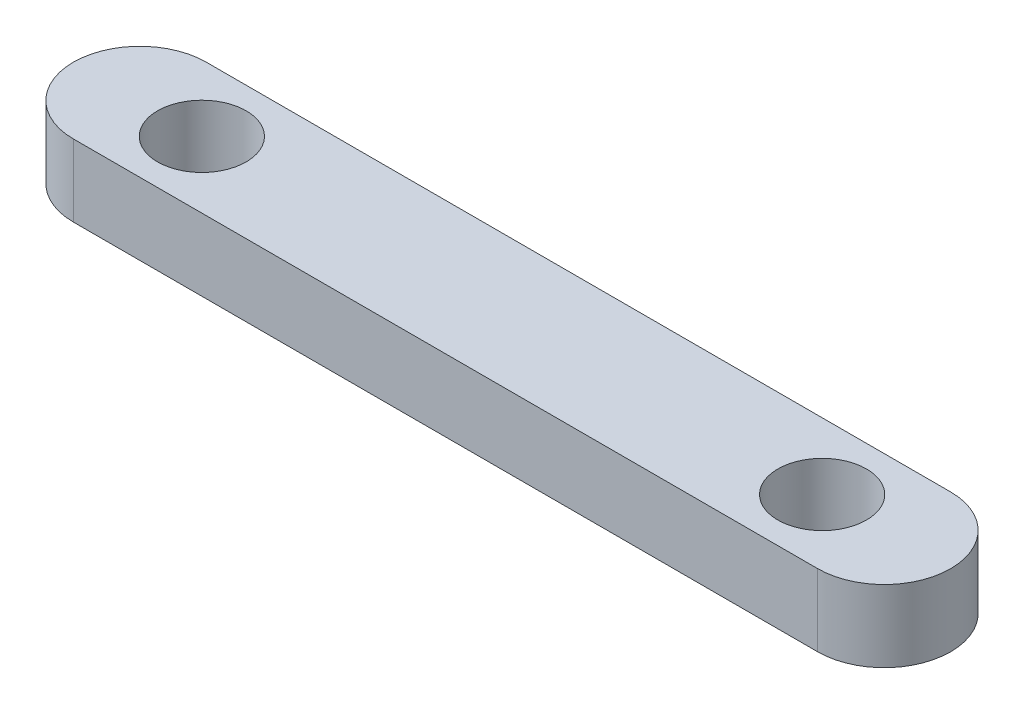
ISO-10303-21;
HEADER;
FILE_DESCRIPTION(('STEP AP214'),'2;1');
FILE_NAME('part.step','',(''),(''),'','','');
FILE_SCHEMA(('AUTOMOTIVE_DESIGN { 1 0 10303 214 1 1 1 1 }'));
ENDSEC;
DATA;
#1=APPLICATION_CONTEXT('core data for automotive mechanical design processes');
#2=APPLICATION_PROTOCOL_DEFINITION('international standard','automotive_design',2000,#1);
#3=PRODUCT_CONTEXT('',#1,'mechanical');
#4=PRODUCT('Part','Part','',(#3));
#5=PRODUCT_RELATED_PRODUCT_CATEGORY('part','',(#4));
#6=PRODUCT_DEFINITION_FORMATION('','',#4);
#7=PRODUCT_DEFINITION_CONTEXT('part definition',#1,'design');
#8=PRODUCT_DEFINITION('design','',#6,#7);
#9=PRODUCT_DEFINITION_SHAPE('','',#8);
#10=(LENGTH_UNIT() NAMED_UNIT(*) SI_UNIT(.MILLI.,.METRE.));
#11=(NAMED_UNIT(*) PLANE_ANGLE_UNIT() SI_UNIT($,.RADIAN.));
#12=(NAMED_UNIT(*) SI_UNIT($,.STERADIAN.) SOLID_ANGLE_UNIT());
#13=UNCERTAINTY_MEASURE_WITH_UNIT(LENGTH_MEASURE(1.E-05),#10,'distance_accuracy_value','');
#14=(GEOMETRIC_REPRESENTATION_CONTEXT(3) GLOBAL_UNCERTAINTY_ASSIGNED_CONTEXT((#13)) GLOBAL_UNIT_ASSIGNED_CONTEXT((#10,
#11,#12)) REPRESENTATION_CONTEXT('',''));
#15=CARTESIAN_POINT('',(0.,0.,0.));
#16=DIRECTION('',(0.,0.,1.));
#17=DIRECTION('',(1.,0.,0.));
#18=AXIS2_PLACEMENT_3D('',#15,#16,#17);
#19=CARTESIAN_POINT('',(0.,2.032,0.));
#20=DIRECTION('',(0.,1.,0.));
#21=DIRECTION('',(0.,0.,1.));
#22=AXIS2_PLACEMENT_3D('',#19,#20,#21);
#23=PLANE('',#22);
#24=CARTESIAN_POINT('',(1.7500092,2.032,0.));
#25=DIRECTION('',(0.,1.,0.));
#26=DIRECTION('',(0.,0.,1.));
#27=AXIS2_PLACEMENT_3D('',#24,#25,#26);
#28=CIRCLE('',#27,1.2499975);
#29=CARTESIAN_POINT('',(1.7500092,2.032,1.2499975));
#30=VERTEX_POINT('',#29);
#31=EDGE_CURVE('E109',#30,#30,#28,.T.);
#32=ORIENTED_EDGE('',*,*,#31,.F.);
#33=EDGE_LOOP('',(#32));
#34=FACE_BOUND('',#33,.T.);
#35=CARTESIAN_POINT('',(0.,2.032,0.));
#36=DIRECTION('',(0.,1.,0.));
#37=DIRECTION('',(0.,0.,1.));
#38=AXIS2_PLACEMENT_3D('',#35,#36,#37);
#39=CIRCLE('',#38,1.8750026);
#40=CARTESIAN_POINT('',(0.,2.032,-1.8750026));
#41=VERTEX_POINT('',#40);
#42=CARTESIAN_POINT('',(0.,2.032,1.8750026));
#43=VERTEX_POINT('',#42);
#44=EDGE_CURVE('E94',#41,#43,#39,.T.);
#45=ORIENTED_EDGE('',*,*,#44,.T.);
#46=DIRECTION('',(1.,0.,0.));
#47=VECTOR('',#46,1.);
#48=CARTESIAN_POINT('',(0.,2.032,1.8750026));
#49=LINE('',#48,#47);
#50=CARTESIAN_POINT('',(21.0000088,2.032,1.8750026));
#51=VERTEX_POINT('',#50);
#52=EDGE_CURVE('E89',#43,#51,#49,.T.);
#53=ORIENTED_EDGE('',*,*,#52,.T.);
#54=CARTESIAN_POINT('',(21.0000088,2.032,0.));
#55=DIRECTION('',(0.,1.,0.));
#56=DIRECTION('',(0.,0.,1.));
#57=AXIS2_PLACEMENT_3D('',#54,#55,#56);
#58=CIRCLE('',#57,1.8750026);
#59=CARTESIAN_POINT('',(21.0000088,2.032,-1.8750026));
#60=VERTEX_POINT('',#59);
#61=EDGE_CURVE('E92',#51,#60,#58,.T.);
#62=ORIENTED_EDGE('',*,*,#61,.T.);
#63=DIRECTION('',(-1.,0.,0.));
#64=VECTOR('',#63,1.);
#65=CARTESIAN_POINT('',(0.,2.032,-1.8750026));
#66=LINE('',#65,#64);
#67=EDGE_CURVE('E59',#60,#41,#66,.T.);
#68=ORIENTED_EDGE('',*,*,#67,.T.);
#69=EDGE_LOOP('',(#45,#53,#62,#68));
#70=FACE_BOUND('',#69,.T.);
#71=CARTESIAN_POINT('',(19.2499996,2.032,0.));
#72=DIRECTION('',(0.,1.,0.));
#73=DIRECTION('',(0.,0.,-1.));
#74=AXIS2_PLACEMENT_3D('',#71,#72,#73);
#75=CIRCLE('',#74,1.2499975);
#76=CARTESIAN_POINT('',(19.2499996,2.032,-1.2499975));
#77=VERTEX_POINT('',#76);
#78=EDGE_CURVE('E124',#77,#77,#75,.T.);
#79=ORIENTED_EDGE('',*,*,#78,.F.);
#80=EDGE_LOOP('',(#79));
#81=FACE_BOUND('',#80,.T.);
#82=ADVANCED_FACE('F42',(#34,#70,#81),#23,.T.);
#83=CARTESIAN_POINT('',(0.,0.,0.));
#84=DIRECTION('',(0.,1.,0.));
#85=DIRECTION('',(0.,0.,1.));
#86=AXIS2_PLACEMENT_3D('',#83,#84,#85);
#87=PLANE('',#86);
#88=CARTESIAN_POINT('',(0.,0.,0.));
#89=DIRECTION('',(0.,1.,0.));
#90=DIRECTION('',(0.,0.,1.));
#91=AXIS2_PLACEMENT_3D('',#88,#89,#90);
#92=CIRCLE('',#91,1.8750026);
#93=CARTESIAN_POINT('',(0.,0.,-1.8750026));
#94=VERTEX_POINT('',#93);
#95=CARTESIAN_POINT('',(0.,0.,1.8750026));
#96=VERTEX_POINT('',#95);
#97=EDGE_CURVE('E106',#94,#96,#92,.T.);
#98=ORIENTED_EDGE('',*,*,#97,.F.);
#99=DIRECTION('',(-1.,0.,0.));
#100=VECTOR('',#99,1.);
#101=CARTESIAN_POINT('',(0.,0.,-1.8750026));
#102=LINE('',#101,#100);
#103=CARTESIAN_POINT('',(21.0000088,0.,-1.8750026));
#104=VERTEX_POINT('',#103);
#105=EDGE_CURVE('E82',#104,#94,#102,.T.);
#106=ORIENTED_EDGE('',*,*,#105,.F.);
#107=CARTESIAN_POINT('',(21.0000088,0.,0.));
#108=DIRECTION('',(0.,1.,0.));
#109=DIRECTION('',(0.,0.,1.));
#110=AXIS2_PLACEMENT_3D('',#107,#108,#109);
#111=CIRCLE('',#110,1.8750026);
#112=CARTESIAN_POINT('',(21.0000088,0.,1.8750026));
#113=VERTEX_POINT('',#112);
#114=EDGE_CURVE('E76',#113,#104,#111,.T.);
#115=ORIENTED_EDGE('',*,*,#114,.F.);
#116=DIRECTION('',(1.,0.,0.));
#117=VECTOR('',#116,1.);
#118=CARTESIAN_POINT('',(0.,0.,1.8750026));
#119=LINE('',#118,#117);
#120=EDGE_CURVE('E98',#96,#113,#119,.T.);
#121=ORIENTED_EDGE('',*,*,#120,.F.);
#122=EDGE_LOOP('',(#98,#106,#115,#121));
#123=FACE_BOUND('',#122,.T.);
#124=CARTESIAN_POINT('',(1.7500092,0.,0.));
#125=DIRECTION('',(0.,1.,0.));
#126=DIRECTION('',(0.,0.,1.));
#127=AXIS2_PLACEMENT_3D('',#124,#125,#126);
#128=CIRCLE('',#127,1.2499975);
#129=CARTESIAN_POINT('',(1.7500092,0.,1.2499975));
#130=VERTEX_POINT('',#129);
#131=EDGE_CURVE('E121',#130,#130,#128,.T.);
#132=ORIENTED_EDGE('',*,*,#131,.T.);
#133=EDGE_LOOP('',(#132));
#134=FACE_BOUND('',#133,.T.);
#135=CARTESIAN_POINT('',(19.2499996,0.,0.));
#136=DIRECTION('',(0.,1.,0.));
#137=DIRECTION('',(0.,0.,-1.));
#138=AXIS2_PLACEMENT_3D('',#135,#136,#137);
#139=CIRCLE('',#138,1.2499975);
#140=CARTESIAN_POINT('',(19.2499996,0.,-1.2499975));
#141=VERTEX_POINT('',#140);
#142=EDGE_CURVE('E127',#141,#141,#139,.T.);
#143=ORIENTED_EDGE('',*,*,#142,.T.);
#144=EDGE_LOOP('',(#143));
#145=FACE_BOUND('',#144,.T.);
#146=ADVANCED_FACE('F117',(#123,#134,#145),#87,.F.);
#147=CARTESIAN_POINT('',(0.,2.032,0.));
#148=DIRECTION('',(0.,-1.,0.));
#149=DIRECTION('',(0.,0.,-1.));
#150=AXIS2_PLACEMENT_3D('',#147,#148,#149);
#151=CYLINDRICAL_SURFACE('',#150,1.8750026);
#152=ORIENTED_EDGE('',*,*,#97,.T.);
#153=DIRECTION('',(0.,-1.,0.));
#154=VECTOR('',#153,1.);
#155=CARTESIAN_POINT('',(0.,2.032,1.8750026));
#156=LINE('',#155,#154);
#157=EDGE_CURVE('E11',#43,#96,#156,.T.);
#158=ORIENTED_EDGE('',*,*,#157,.F.);
#159=ORIENTED_EDGE('',*,*,#44,.F.);
#160=DIRECTION('',(0.,-1.,0.));
#161=VECTOR('',#160,1.);
#162=CARTESIAN_POINT('',(0.,2.032,-1.8750026));
#163=LINE('',#162,#161);
#164=EDGE_CURVE('E102',#41,#94,#163,.T.);
#165=ORIENTED_EDGE('',*,*,#164,.T.);
#166=EDGE_LOOP('',(#152,#158,#159,#165));
#167=FACE_BOUND('',#166,.T.);
#168=ADVANCED_FACE('F44',(#167),#151,.T.);
#169=CARTESIAN_POINT('',(0.,2.032,1.8750026));
#170=DIRECTION('',(0.,0.,-1.));
#171=DIRECTION('',(-1.,0.,0.));
#172=AXIS2_PLACEMENT_3D('',#169,#170,#171);
#173=PLANE('',#172);
#174=ORIENTED_EDGE('',*,*,#120,.T.);
#175=DIRECTION('',(0.,-1.,0.));
#176=VECTOR('',#175,1.);
#177=CARTESIAN_POINT('',(21.0000088,2.032,1.8750026));
#178=LINE('',#177,#176);
#179=EDGE_CURVE('E51',#51,#113,#178,.T.);
#180=ORIENTED_EDGE('',*,*,#179,.F.);
#181=ORIENTED_EDGE('',*,*,#52,.F.);
#182=ORIENTED_EDGE('',*,*,#157,.T.);
#183=EDGE_LOOP('',(#174,#180,#181,#182));
#184=FACE_BOUND('',#183,.T.);
#185=ADVANCED_FACE('F97',(#184),#173,.F.);
#186=CARTESIAN_POINT('',(21.0000088,2.032,0.));
#187=DIRECTION('',(0.,-1.,0.));
#188=DIRECTION('',(0.,0.,-1.));
#189=AXIS2_PLACEMENT_3D('',#186,#187,#188);
#190=CYLINDRICAL_SURFACE('',#189,1.8750026);
#191=ORIENTED_EDGE('',*,*,#114,.T.);
#192=DIRECTION('',(0.,-1.,0.));
#193=VECTOR('',#192,1.);
#194=CARTESIAN_POINT('',(21.0000088,2.032,-1.8750026));
#195=LINE('',#194,#193);
#196=EDGE_CURVE('E99',#60,#104,#195,.T.);
#197=ORIENTED_EDGE('',*,*,#196,.F.);
#198=ORIENTED_EDGE('',*,*,#61,.F.);
#199=ORIENTED_EDGE('',*,*,#179,.T.);
#200=EDGE_LOOP('',(#191,#197,#198,#199));
#201=FACE_BOUND('',#200,.T.);
#202=ADVANCED_FACE('F100',(#201),#190,.T.);
#203=CARTESIAN_POINT('',(0.,2.032,-1.8750026));
#204=DIRECTION('',(0.,0.,1.));
#205=DIRECTION('',(1.,0.,0.));
#206=AXIS2_PLACEMENT_3D('',#203,#204,#205);
#207=PLANE('',#206);
#208=ORIENTED_EDGE('',*,*,#105,.T.);
#209=ORIENTED_EDGE('',*,*,#164,.F.);
#210=ORIENTED_EDGE('',*,*,#67,.F.);
#211=ORIENTED_EDGE('',*,*,#196,.T.);
#212=EDGE_LOOP('',(#208,#209,#210,#211));
#213=FACE_BOUND('',#212,.T.);
#214=ADVANCED_FACE('F114',(#213),#207,.F.);
#215=CARTESIAN_POINT('',(1.7500092,2.032,0.));
#216=DIRECTION('',(0.,-1.,0.));
#217=DIRECTION('',(0.,0.,-1.));
#218=AXIS2_PLACEMENT_3D('',#215,#216,#217);
#219=CYLINDRICAL_SURFACE('',#218,1.2499975);
#220=ORIENTED_EDGE('',*,*,#31,.T.);
#221=EDGE_LOOP('',(#220));
#222=FACE_BOUND('',#221,.T.);
#223=ORIENTED_EDGE('',*,*,#131,.F.);
#224=EDGE_LOOP('',(#223));
#225=FACE_BOUND('',#224,.T.);
#226=ADVANCED_FACE('F144',(#222,#225),#219,.F.);
#227=CARTESIAN_POINT('',(19.2499996,2.032,0.));
#228=DIRECTION('',(0.,-1.,0.));
#229=DIRECTION('',(0.,0.,-1.));
#230=AXIS2_PLACEMENT_3D('',#227,#228,#229);
#231=CYLINDRICAL_SURFACE('',#230,1.2499975);
#232=ORIENTED_EDGE('',*,*,#78,.T.);
#233=EDGE_LOOP('',(#232));
#234=FACE_BOUND('',#233,.T.);
#235=ORIENTED_EDGE('',*,*,#142,.F.);
#236=EDGE_LOOP('',(#235));
#237=FACE_BOUND('',#236,.T.);
#238=ADVANCED_FACE('F133',(#234,#237),#231,.F.);
#239=CLOSED_SHELL('',(#82,#146,#168,#185,#202,#214,#226,#238));
#240=MANIFOLD_SOLID_BREP('B2',#239);
#241=ADVANCED_BREP_SHAPE_REPRESENTATION('',(#18,#240),#14);
#242=SHAPE_DEFINITION_REPRESENTATION(#9,#241);
ENDSEC;
END-ISO-10303-21;
